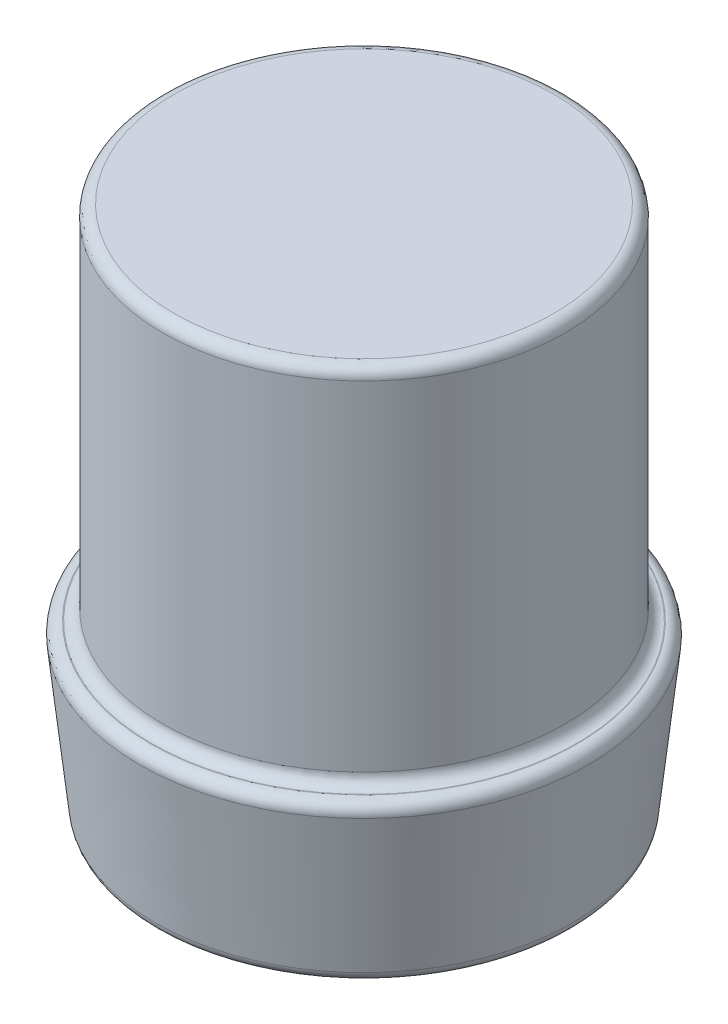
ISO-10303-21;
HEADER;
FILE_DESCRIPTION(('STEP AP214'),'2;1');
FILE_NAME('part.step','',(''),(''),'','','');
FILE_SCHEMA(('AUTOMOTIVE_DESIGN { 1 0 10303 214 1 1 1 1 }'));
ENDSEC;
DATA;
#1=APPLICATION_CONTEXT('core data for automotive mechanical design processes');
#2=APPLICATION_PROTOCOL_DEFINITION('international standard','automotive_design',2000,#1);
#3=PRODUCT_CONTEXT('',#1,'mechanical');
#4=PRODUCT('Part','Part','',(#3));
#5=PRODUCT_RELATED_PRODUCT_CATEGORY('part','',(#4));
#6=PRODUCT_DEFINITION_FORMATION('','',#4);
#7=PRODUCT_DEFINITION_CONTEXT('part definition',#1,'design');
#8=PRODUCT_DEFINITION('design','',#6,#7);
#9=PRODUCT_DEFINITION_SHAPE('','',#8);
#10=(LENGTH_UNIT() NAMED_UNIT(*) SI_UNIT(.MILLI.,.METRE.));
#11=(NAMED_UNIT(*) PLANE_ANGLE_UNIT() SI_UNIT($,.RADIAN.));
#12=(NAMED_UNIT(*) SI_UNIT($,.STERADIAN.) SOLID_ANGLE_UNIT());
#13=UNCERTAINTY_MEASURE_WITH_UNIT(LENGTH_MEASURE(1.E-05),#10,'distance_accuracy_value','');
#14=(GEOMETRIC_REPRESENTATION_CONTEXT(3) GLOBAL_UNCERTAINTY_ASSIGNED_CONTEXT((#13)) GLOBAL_UNIT_ASSIGNED_CONTEXT((#10,
#11,#12)) REPRESENTATION_CONTEXT('',''));
#15=CARTESIAN_POINT('',(0.,0.,0.));
#16=DIRECTION('',(0.,0.,1.));
#17=DIRECTION('',(1.,0.,0.));
#18=AXIS2_PLACEMENT_3D('',#15,#16,#17);
#19=CARTESIAN_POINT('',(0.,0.,4.6));
#20=DIRECTION('',(0.,-1.,0.));
#21=DIRECTION('',(0.,0.,-1.));
#22=AXIS2_PLACEMENT_3D('',#19,#20,#21);
#23=PLANE('',#22);
#24=CARTESIAN_POINT('',(0.,0.,0.));
#25=DIRECTION('',(0.,1.,0.));
#26=DIRECTION('',(0.,0.,-1.));
#27=AXIS2_PLACEMENT_3D('',#24,#25,#26);
#28=CIRCLE('',#27,4.37557035046043);
#29=CARTESIAN_POINT('',(0.,0.,4.37557035046043));
#30=VERTEX_POINT('',#29);
#31=CARTESIAN_POINT('',(0.,0.,-4.37557035046043));
#32=VERTEX_POINT('',#31);
#33=EDGE_CURVE('E11',#30,#32,#28,.T.);
#34=ORIENTED_EDGE('',*,*,#33,.F.);
#35=CARTESIAN_POINT('',(0.,0.,0.));
#36=DIRECTION('',(0.,1.,0.));
#37=DIRECTION('',(0.,0.,-1.));
#38=AXIS2_PLACEMENT_3D('',#35,#36,#37);
#39=CIRCLE('',#38,4.37557035046043);
#40=EDGE_CURVE('E27',#32,#30,#39,.T.);
#41=ORIENTED_EDGE('',*,*,#40,.F.);
#42=EDGE_LOOP('',(#34,#41));
#43=FACE_BOUND('',#42,.T.);
#44=ADVANCED_FACE('F16',(#43),#23,.T.);
#45=CARTESIAN_POINT('',(0.,0.25,0.));
#46=DIRECTION('',(0.,1.,0.));
#47=DIRECTION('',(0.,0.,1.));
#48=AXIS2_PLACEMENT_3D('',#45,#46,#47);
#49=TOROIDAL_SURFACE('',#48,4.37557035046043,0.25);
#50=CARTESIAN_POINT('',(0.,0.223129539254977,0.));
#51=DIRECTION('',(0.,-1.,0.));
#52=DIRECTION('',(0.,0.,-1.));
#53=AXIS2_PLACEMENT_3D('',#50,#51,#52);
#54=CIRCLE('',#53,4.62412211235189);
#55=CARTESIAN_POINT('',(0.,0.223129539254977,4.62412211235189));
#56=VERTEX_POINT('',#55);
#57=CARTESIAN_POINT('',(0.,0.223129539254976,-4.62412211235189));
#58=VERTEX_POINT('',#57);
#59=EDGE_CURVE('E121',#56,#58,#54,.T.);
#60=ORIENTED_EDGE('',*,*,#59,.T.);
#61=CARTESIAN_POINT('',(0.,0.25,-4.37557035046043));
#62=DIRECTION('',(-1.,0.,0.));
#63=DIRECTION('',(0.,0.,-1.));
#64=AXIS2_PLACEMENT_3D('',#61,#62,#63);
#65=CIRCLE('',#64,0.25);
#66=EDGE_CURVE('E140',#58,#32,#65,.T.);
#67=ORIENTED_EDGE('',*,*,#66,.T.);
#68=ORIENTED_EDGE('',*,*,#40,.T.);
#69=ORIENTED_EDGE('',*,*,#33,.T.);
#70=ORIENTED_EDGE('',*,*,#66,.F.);
#71=CARTESIAN_POINT('',(0.,0.223129539254977,0.));
#72=DIRECTION('',(0.,-1.,0.));
#73=DIRECTION('',(0.,0.,-1.));
#74=AXIS2_PLACEMENT_3D('',#71,#72,#73);
#75=CIRCLE('',#74,4.62412211235189);
#76=EDGE_CURVE('E163',#58,#56,#75,.T.);
#77=ORIENTED_EDGE('',*,*,#76,.T.);
#78=EDGE_LOOP('',(#60,#67,#68,#69,#70,#77));
#79=FACE_BOUND('',#78,.T.);
#80=ADVANCED_FACE('F227',(#79),#49,.T.);
#81=CARTESIAN_POINT('',(0.,1.85,0.));
#82=DIRECTION('',(0.,1.,0.));
#83=DIRECTION('',(0.,0.,1.));
#84=AXIS2_PLACEMENT_3D('',#81,#82,#83);
#85=CONICAL_SURFACE('',#84,4.8,0.107689870832821);
#86=CARTESIAN_POINT('',(0.,3.42312953925498,0.));
#87=DIRECTION('',(0.,1.,0.));
#88=DIRECTION('',(0.,0.,-1.));
#89=AXIS2_PLACEMENT_3D('',#86,#87,#88);
#90=CIRCLE('',#89,4.97006805829784);
#91=CARTESIAN_POINT('',(0.,3.42312953925498,4.97006805829784));
#92=VERTEX_POINT('',#91);
#93=CARTESIAN_POINT('',(0.,3.42312953925498,-4.97006805829784));
#94=VERTEX_POINT('',#93);
#95=EDGE_CURVE('E173',#92,#94,#90,.T.);
#96=ORIENTED_EDGE('',*,*,#95,.F.);
#97=CARTESIAN_POINT('',(0.,3.42312953925498,0.));
#98=DIRECTION('',(0.,1.,0.));
#99=DIRECTION('',(0.,0.,-1.));
#100=AXIS2_PLACEMENT_3D('',#97,#98,#99);
#101=CIRCLE('',#100,4.97006805829784);
#102=EDGE_CURVE('E172',#94,#92,#101,.T.);
#103=ORIENTED_EDGE('',*,*,#102,.F.);
#104=DIRECTION('',(0.,-0.994207047565849,0.107481842980092));
#105=VECTOR('',#104,1.);
#106=CARTESIAN_POINT('',(0.,1.85,-4.8));
#107=LINE('',#106,#105);
#108=EDGE_CURVE('E161',#94,#58,#107,.T.);
#109=ORIENTED_EDGE('',*,*,#108,.T.);
#110=ORIENTED_EDGE('',*,*,#59,.F.);
#111=ORIENTED_EDGE('',*,*,#76,.F.);
#112=ORIENTED_EDGE('',*,*,#108,.F.);
#113=EDGE_LOOP('',(#96,#103,#109,#110,#111,#112));
#114=FACE_BOUND('',#113,.T.);
#115=ADVANCED_FACE('F239',(#114),#85,.T.);
#116=CARTESIAN_POINT('',(0.,3.45,0.));
#117=DIRECTION('',(0.,1.,0.));
#118=DIRECTION('',(0.,0.,1.));
#119=AXIS2_PLACEMENT_3D('',#116,#117,#118);
#120=TOROIDAL_SURFACE('',#119,4.72151629640637,0.25);
#121=CARTESIAN_POINT('',(0.,3.7,0.));
#122=DIRECTION('',(0.,-1.,0.));
#123=DIRECTION('',(0.,0.,-1.));
#124=AXIS2_PLACEMENT_3D('',#121,#122,#123);
#125=CIRCLE('',#124,4.72151629640637);
#126=CARTESIAN_POINT('',(0.,3.7,4.72151629640637));
#127=VERTEX_POINT('',#126);
#128=CARTESIAN_POINT('',(0.,3.7,-4.72151629640637));
#129=VERTEX_POINT('',#128);
#130=EDGE_CURVE('E132',#127,#129,#125,.T.);
#131=ORIENTED_EDGE('',*,*,#130,.T.);
#132=CARTESIAN_POINT('',(0.,3.45,-4.72151629640637));
#133=DIRECTION('',(-1.,0.,0.));
#134=DIRECTION('',(0.,0.,-1.));
#135=AXIS2_PLACEMENT_3D('',#132,#133,#134);
#136=CIRCLE('',#135,0.25);
#137=EDGE_CURVE('E168',#129,#94,#136,.T.);
#138=ORIENTED_EDGE('',*,*,#137,.T.);
#139=ORIENTED_EDGE('',*,*,#102,.T.);
#140=ORIENTED_EDGE('',*,*,#95,.T.);
#141=ORIENTED_EDGE('',*,*,#137,.F.);
#142=CARTESIAN_POINT('',(0.,3.7,0.));
#143=DIRECTION('',(0.,-1.,0.));
#144=DIRECTION('',(0.,0.,-1.));
#145=AXIS2_PLACEMENT_3D('',#142,#143,#144);
#146=CIRCLE('',#145,4.72151629640637);
#147=EDGE_CURVE('E136',#129,#127,#146,.T.);
#148=ORIENTED_EDGE('',*,*,#147,.T.);
#149=EDGE_LOOP('',(#131,#138,#139,#140,#141,#148));
#150=FACE_BOUND('',#149,.T.);
#151=ADVANCED_FACE('F234',(#150),#120,.T.);
#152=CARTESIAN_POINT('',(0.,3.7,4.455));
#153=DIRECTION('',(0.,1.,0.));
#154=DIRECTION('',(1.,0.,0.));
#155=AXIS2_PLACEMENT_3D('',#152,#153,#154);
#156=PLANE('',#155);
#157=CARTESIAN_POINT('',(0.,3.7,0.));
#158=DIRECTION('',(0.,1.,0.));
#159=DIRECTION('',(0.,0.,-1.));
#160=AXIS2_PLACEMENT_3D('',#157,#158,#159);
#161=CIRCLE('',#160,4.705);
#162=CARTESIAN_POINT('',(0.,3.7,4.705));
#163=VERTEX_POINT('',#162);
#164=CARTESIAN_POINT('',(0.,3.7,-4.705));
#165=VERTEX_POINT('',#164);
#166=EDGE_CURVE('E144',#163,#165,#161,.T.);
#167=ORIENTED_EDGE('',*,*,#166,.F.);
#168=CARTESIAN_POINT('',(0.,3.7,0.));
#169=DIRECTION('',(0.,1.,0.));
#170=DIRECTION('',(0.,0.,-1.));
#171=AXIS2_PLACEMENT_3D('',#168,#169,#170);
#172=CIRCLE('',#171,4.705);
#173=EDGE_CURVE('E129',#165,#163,#172,.T.);
#174=ORIENTED_EDGE('',*,*,#173,.F.);
#175=EDGE_LOOP('',(#167,#174));
#176=FACE_BOUND('',#175,.T.);
#177=ORIENTED_EDGE('',*,*,#130,.F.);
#178=ORIENTED_EDGE('',*,*,#147,.F.);
#179=EDGE_LOOP('',(#177,#178));
#180=FACE_BOUND('',#179,.T.);
#181=ADVANCED_FACE('F18',(#176,#180),#156,.T.);
#182=CARTESIAN_POINT('',(0.,3.95,0.));
#183=DIRECTION('',(0.,1.,0.));
#184=DIRECTION('',(0.,0.,1.));
#185=AXIS2_PLACEMENT_3D('',#182,#183,#184);
#186=TOROIDAL_SURFACE('',#185,4.705,0.25);
#187=ORIENTED_EDGE('',*,*,#166,.T.);
#188=CARTESIAN_POINT('',(0.,3.95,-4.705));
#189=DIRECTION('',(-1.,0.,0.));
#190=DIRECTION('',(0.,0.,-1.));
#191=AXIS2_PLACEMENT_3D('',#188,#189,#190);
#192=CIRCLE('',#191,0.25);
#193=CARTESIAN_POINT('',(0.,3.95,-4.455));
#194=VERTEX_POINT('',#193);
#195=EDGE_CURVE('E20',#165,#194,#192,.T.);
#196=ORIENTED_EDGE('',*,*,#195,.T.);
#197=CARTESIAN_POINT('',(0.,3.95,0.));
#198=DIRECTION('',(0.,-1.,0.));
#199=DIRECTION('',(0.,0.,-1.));
#200=AXIS2_PLACEMENT_3D('',#197,#198,#199);
#201=CIRCLE('',#200,4.455);
#202=CARTESIAN_POINT('',(0.,3.95,4.455));
#203=VERTEX_POINT('',#202);
#204=EDGE_CURVE('E128',#194,#203,#201,.T.);
#205=ORIENTED_EDGE('',*,*,#204,.T.);
#206=CARTESIAN_POINT('',(0.,3.95,0.));
#207=DIRECTION('',(0.,-1.,0.));
#208=DIRECTION('',(0.,0.,-1.));
#209=AXIS2_PLACEMENT_3D('',#206,#207,#208);
#210=CIRCLE('',#209,4.455);
#211=EDGE_CURVE('E124',#203,#194,#210,.T.);
#212=ORIENTED_EDGE('',*,*,#211,.T.);
#213=ORIENTED_EDGE('',*,*,#195,.F.);
#214=ORIENTED_EDGE('',*,*,#173,.T.);
#215=EDGE_LOOP('',(#187,#196,#205,#212,#213,#214));
#216=FACE_BOUND('',#215,.T.);
#217=ADVANCED_FACE('F214',(#216),#186,.F.);
#218=CARTESIAN_POINT('',(0.,11.7,0.));
#219=DIRECTION('',(0.,1.,0.));
#220=DIRECTION('',(1.,0.,0.));
#221=AXIS2_PLACEMENT_3D('',#218,#219,#220);
#222=PLANE('',#221);
#223=CARTESIAN_POINT('',(0.,11.7,0.));
#224=DIRECTION('',(0.,-1.,0.));
#225=DIRECTION('',(0.,0.,-1.));
#226=AXIS2_PLACEMENT_3D('',#223,#224,#225);
#227=CIRCLE('',#226,4.205);
#228=CARTESIAN_POINT('',(0.,11.7,4.205));
#229=VERTEX_POINT('',#228);
#230=CARTESIAN_POINT('',(0.,11.7,-4.205));
#231=VERTEX_POINT('',#230);
#232=EDGE_CURVE('E100',#229,#231,#227,.T.);
#233=ORIENTED_EDGE('',*,*,#232,.F.);
#234=CARTESIAN_POINT('',(0.,11.7,0.));
#235=DIRECTION('',(0.,-1.,0.));
#236=DIRECTION('',(0.,0.,-1.));
#237=AXIS2_PLACEMENT_3D('',#234,#235,#236);
#238=CIRCLE('',#237,4.205);
#239=EDGE_CURVE('E96',#231,#229,#238,.T.);
#240=ORIENTED_EDGE('',*,*,#239,.F.);
#241=EDGE_LOOP('',(#233,#240));
#242=FACE_BOUND('',#241,.T.);
#243=ADVANCED_FACE('F98',(#242),#222,.T.);
#244=CARTESIAN_POINT('',(0.,7.7,0.));
#245=DIRECTION('',(0.,1.,0.));
#246=DIRECTION('',(0.,0.,1.));
#247=AXIS2_PLACEMENT_3D('',#244,#245,#246);
#248=CYLINDRICAL_SURFACE('',#247,4.455);
#249=CARTESIAN_POINT('',(0.,11.45,0.));
#250=DIRECTION('',(0.,1.,0.));
#251=DIRECTION('',(0.,0.,-1.));
#252=AXIS2_PLACEMENT_3D('',#249,#250,#251);
#253=CIRCLE('',#252,4.455);
#254=CARTESIAN_POINT('',(0.,11.45,4.455));
#255=VERTEX_POINT('',#254);
#256=CARTESIAN_POINT('',(0.,11.45,-4.455));
#257=VERTEX_POINT('',#256);
#258=EDGE_CURVE('E104',#255,#257,#253,.T.);
#259=ORIENTED_EDGE('',*,*,#258,.F.);
#260=CARTESIAN_POINT('',(0.,11.45,0.));
#261=DIRECTION('',(0.,1.,0.));
#262=DIRECTION('',(0.,0.,-1.));
#263=AXIS2_PLACEMENT_3D('',#260,#261,#262);
#264=CIRCLE('',#263,4.455);
#265=EDGE_CURVE('E113',#257,#255,#264,.T.);
#266=ORIENTED_EDGE('',*,*,#265,.F.);
#267=DIRECTION('',(0.,-1.,0.));
#268=VECTOR('',#267,1.);
#269=CARTESIAN_POINT('',(0.,7.7,-4.455));
#270=LINE('',#269,#268);
#271=EDGE_CURVE('E103',#257,#194,#270,.T.);
#272=ORIENTED_EDGE('',*,*,#271,.T.);
#273=ORIENTED_EDGE('',*,*,#211,.F.);
#274=ORIENTED_EDGE('',*,*,#204,.F.);
#275=ORIENTED_EDGE('',*,*,#271,.F.);
#276=EDGE_LOOP('',(#259,#266,#272,#273,#274,#275));
#277=FACE_BOUND('',#276,.T.);
#278=ADVANCED_FACE('F213',(#277),#248,.T.);
#279=CARTESIAN_POINT('',(0.,11.45,0.));
#280=DIRECTION('',(0.,1.,0.));
#281=DIRECTION('',(0.,0.,1.));
#282=AXIS2_PLACEMENT_3D('',#279,#280,#281);
#283=TOROIDAL_SURFACE('',#282,4.205,0.25);
#284=ORIENTED_EDGE('',*,*,#232,.T.);
#285=CARTESIAN_POINT('',(0.,11.45,-4.205));
#286=DIRECTION('',(-1.,0.,0.));
#287=DIRECTION('',(0.,0.,-1.));
#288=AXIS2_PLACEMENT_3D('',#285,#286,#287);
#289=CIRCLE('',#288,0.25);
#290=EDGE_CURVE('E108',#231,#257,#289,.T.);
#291=ORIENTED_EDGE('',*,*,#290,.T.);
#292=ORIENTED_EDGE('',*,*,#265,.T.);
#293=ORIENTED_EDGE('',*,*,#258,.T.);
#294=ORIENTED_EDGE('',*,*,#290,.F.);
#295=ORIENTED_EDGE('',*,*,#239,.T.);
#296=EDGE_LOOP('',(#284,#291,#292,#293,#294,#295));
#297=FACE_BOUND('',#296,.T.);
#298=ADVANCED_FACE('F109',(#297),#283,.T.);
#299=CLOSED_SHELL('',(#44,#80,#115,#151,#181,#217,#243,#278,#298));
#300=MANIFOLD_SOLID_BREP('B1',#299);
#301=ADVANCED_BREP_SHAPE_REPRESENTATION('',(#18,#300),#14);
#302=SHAPE_DEFINITION_REPRESENTATION(#9,#301);
ENDSEC;
END-ISO-10303-21;
